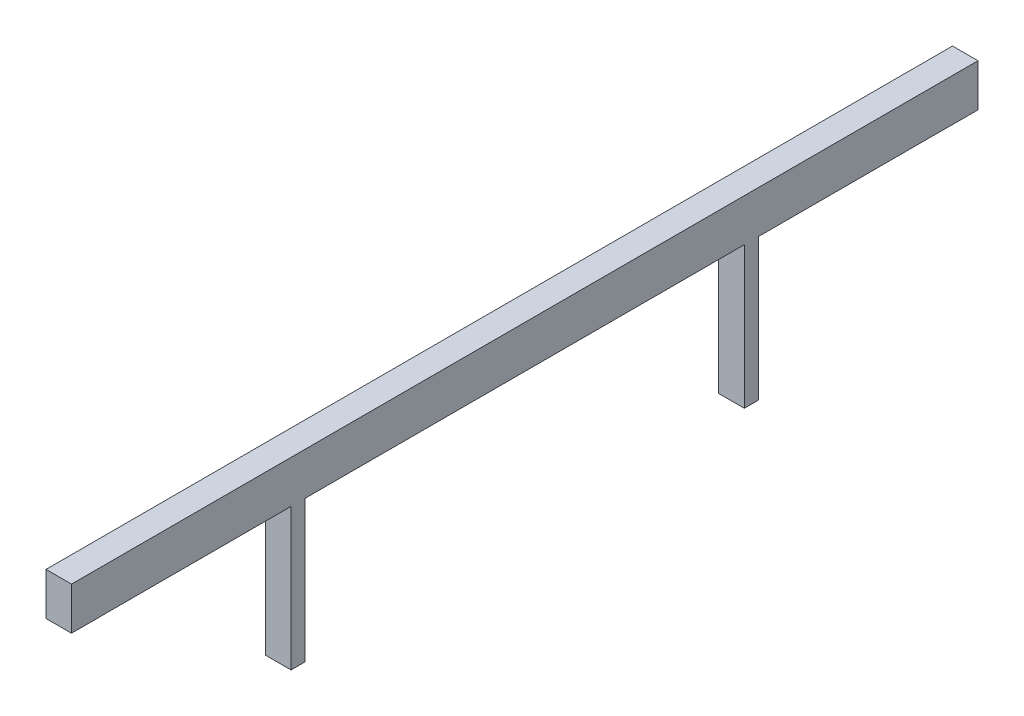
ISO-10303-21;
HEADER;
FILE_DESCRIPTION(('STEP AP214'),'2;1');
FILE_NAME('part.step','',(''),(''),'','','');
FILE_SCHEMA(('AUTOMOTIVE_DESIGN { 1 0 10303 214 1 1 1 1 }'));
ENDSEC;
DATA;
#1=APPLICATION_CONTEXT('core data for automotive mechanical design processes');
#2=APPLICATION_PROTOCOL_DEFINITION('international standard','automotive_design',2000,#1);
#3=PRODUCT_CONTEXT('',#1,'mechanical');
#4=PRODUCT('Part','Part','',(#3));
#5=PRODUCT_RELATED_PRODUCT_CATEGORY('part','',(#4));
#6=PRODUCT_DEFINITION_FORMATION('','',#4);
#7=PRODUCT_DEFINITION_CONTEXT('part definition',#1,'design');
#8=PRODUCT_DEFINITION('design','',#6,#7);
#9=PRODUCT_DEFINITION_SHAPE('','',#8);
#10=(LENGTH_UNIT() NAMED_UNIT(*) SI_UNIT(.MILLI.,.METRE.));
#11=(NAMED_UNIT(*) PLANE_ANGLE_UNIT() SI_UNIT($,.RADIAN.));
#12=(NAMED_UNIT(*) SI_UNIT($,.STERADIAN.) SOLID_ANGLE_UNIT());
#13=UNCERTAINTY_MEASURE_WITH_UNIT(LENGTH_MEASURE(1.E-05),#10,'distance_accuracy_value','');
#14=(GEOMETRIC_REPRESENTATION_CONTEXT(3) GLOBAL_UNCERTAINTY_ASSIGNED_CONTEXT((#13)) GLOBAL_UNIT_ASSIGNED_CONTEXT((#10,
#11,#12)) REPRESENTATION_CONTEXT('',''));
#15=CARTESIAN_POINT('',(0.,0.,0.));
#16=DIRECTION('',(0.,0.,1.));
#17=DIRECTION('',(1.,0.,0.));
#18=AXIS2_PLACEMENT_3D('',#15,#16,#17);
#19=CARTESIAN_POINT('',(-9.,-15.,300.));
#20=DIRECTION('',(0.,1.,0.));
#21=DIRECTION('',(0.,0.,1.));
#22=AXIS2_PLACEMENT_3D('',#19,#20,#21);
#23=PLANE('',#22);
#24=DIRECTION('',(0.,0.,-1.));
#25=VECTOR('',#24,1.);
#26=CARTESIAN_POINT('',(9.,-15.,300.));
#27=LINE('',#26,#25);
#28=CARTESIAN_POINT('',(9.,-15.,-165.));
#29=VERTEX_POINT('',#28);
#30=CARTESIAN_POINT('',(9.,-15.,-300.));
#31=VERTEX_POINT('',#30);
#32=EDGE_CURVE('E54',#29,#31,#27,.T.);
#33=ORIENTED_EDGE('',*,*,#32,.F.);
#34=DIRECTION('',(-1.,0.,0.));
#35=VECTOR('',#34,1.);
#36=CARTESIAN_POINT('',(-9.05537632584334,-15.,-165.));
#37=LINE('',#36,#35);
#38=CARTESIAN_POINT('',(-9.,-15.,-165.));
#39=VERTEX_POINT('',#38);
#40=EDGE_CURVE('E200',#29,#39,#37,.T.);
#41=ORIENTED_EDGE('',*,*,#40,.T.);
#42=DIRECTION('',(0.,0.,-1.));
#43=VECTOR('',#42,1.);
#44=CARTESIAN_POINT('',(-9.,-15.,300.));
#45=LINE('',#44,#43);
#46=CARTESIAN_POINT('',(-9.,-15.,-300.));
#47=VERTEX_POINT('',#46);
#48=EDGE_CURVE('E295',#39,#47,#45,.T.);
#49=ORIENTED_EDGE('',*,*,#48,.T.);
#50=DIRECTION('',(1.,0.,0.));
#51=VECTOR('',#50,1.);
#52=CARTESIAN_POINT('',(-9.,-15.,-300.));
#53=LINE('',#52,#51);
#54=EDGE_CURVE('E287',#47,#31,#53,.T.);
#55=ORIENTED_EDGE('',*,*,#54,.T.);
#56=EDGE_LOOP('',(#33,#41,#49,#55));
#57=FACE_BOUND('',#56,.T.);
#58=ADVANCED_FACE('F39',(#57),#23,.F.);
#59=CARTESIAN_POINT('',(-9.,-15.,155.));
#60=VERTEX_POINT('',#59);
#61=CARTESIAN_POINT('',(-9.,-15.,-155.));
#62=VERTEX_POINT('',#61);
#63=EDGE_CURVE('E351',#60,#62,#45,.T.);
#64=ORIENTED_EDGE('',*,*,#63,.T.);
#65=DIRECTION('',(1.,0.,0.));
#66=VECTOR('',#65,1.);
#67=CARTESIAN_POINT('',(-9.05537632584334,-15.,-155.));
#68=LINE('',#67,#66);
#69=CARTESIAN_POINT('',(9.,-15.,-155.));
#70=VERTEX_POINT('',#69);
#71=EDGE_CURVE('E62',#62,#70,#68,.T.);
#72=ORIENTED_EDGE('',*,*,#71,.T.);
#73=CARTESIAN_POINT('',(9.,-15.,155.));
#74=VERTEX_POINT('',#73);
#75=EDGE_CURVE('E296',#74,#70,#27,.T.);
#76=ORIENTED_EDGE('',*,*,#75,.F.);
#77=DIRECTION('',(1.,0.,0.));
#78=VECTOR('',#77,1.);
#79=CARTESIAN_POINT('',(-9.,-15.,155.));
#80=LINE('',#79,#78);
#81=EDGE_CURVE('E11',#60,#74,#80,.T.);
#82=ORIENTED_EDGE('',*,*,#81,.F.);
#83=EDGE_LOOP('',(#64,#72,#76,#82));
#84=FACE_BOUND('',#83,.T.);
#85=ADVANCED_FACE('F350',(#84),#23,.F.);
#86=DIRECTION('',(-1.,0.,0.));
#87=VECTOR('',#86,1.);
#88=CARTESIAN_POINT('',(-9.05537632584334,-15.,165.));
#89=LINE('',#88,#87);
#90=CARTESIAN_POINT('',(9.,-15.,165.));
#91=VERTEX_POINT('',#90);
#92=CARTESIAN_POINT('',(-9.,-15.,165.));
#93=VERTEX_POINT('',#92);
#94=EDGE_CURVE('E213',#91,#93,#89,.T.);
#95=ORIENTED_EDGE('',*,*,#94,.F.);
#96=CARTESIAN_POINT('',(9.,-15.,300.));
#97=VERTEX_POINT('',#96);
#98=EDGE_CURVE('E292',#97,#91,#27,.T.);
#99=ORIENTED_EDGE('',*,*,#98,.F.);
#100=DIRECTION('',(1.,0.,0.));
#101=VECTOR('',#100,1.);
#102=CARTESIAN_POINT('',(-9.,-15.,300.));
#103=LINE('',#102,#101);
#104=CARTESIAN_POINT('',(-9.,-15.,300.));
#105=VERTEX_POINT('',#104);
#106=EDGE_CURVE('E288',#105,#97,#103,.T.);
#107=ORIENTED_EDGE('',*,*,#106,.F.);
#108=EDGE_CURVE('E297',#105,#93,#45,.T.);
#109=ORIENTED_EDGE('',*,*,#108,.T.);
#110=EDGE_LOOP('',(#95,#99,#107,#109));
#111=FACE_BOUND('',#110,.T.);
#112=ADVANCED_FACE('F334',(#111),#23,.F.);
#113=CARTESIAN_POINT('',(9.,-15.,300.));
#114=DIRECTION('',(-1.,0.,0.));
#115=DIRECTION('',(0.,0.,1.));
#116=AXIS2_PLACEMENT_3D('',#113,#114,#115);
#117=PLANE('',#116);
#118=ORIENTED_EDGE('',*,*,#98,.T.);
#119=DIRECTION('',(0.,1.,0.));
#120=VECTOR('',#119,1.);
#121=CARTESIAN_POINT('',(9.,-115.,165.));
#122=LINE('',#121,#120);
#123=CARTESIAN_POINT('',(9.,-115.,165.));
#124=VERTEX_POINT('',#123);
#125=EDGE_CURVE('E230',#124,#91,#122,.T.);
#126=ORIENTED_EDGE('',*,*,#125,.F.);
#127=DIRECTION('',(0.,0.,1.));
#128=VECTOR('',#127,1.);
#129=CARTESIAN_POINT('',(9.,-115.,165.));
#130=LINE('',#129,#128);
#131=CARTESIAN_POINT('',(9.,-115.,155.));
#132=VERTEX_POINT('',#131);
#133=EDGE_CURVE('E215',#132,#124,#130,.T.);
#134=ORIENTED_EDGE('',*,*,#133,.F.);
#135=DIRECTION('',(0.,1.,0.));
#136=VECTOR('',#135,1.);
#137=CARTESIAN_POINT('',(9.,-115.,155.));
#138=LINE('',#137,#136);
#139=EDGE_CURVE('E233',#132,#74,#138,.T.);
#140=ORIENTED_EDGE('',*,*,#139,.T.);
#141=ORIENTED_EDGE('',*,*,#75,.T.);
#142=DIRECTION('',(0.,1.,0.));
#143=VECTOR('',#142,1.);
#144=CARTESIAN_POINT('',(9.,-115.,-155.));
#145=LINE('',#144,#143);
#146=CARTESIAN_POINT('',(9.,-115.,-155.));
#147=VERTEX_POINT('',#146);
#148=EDGE_CURVE('E205',#147,#70,#145,.T.);
#149=ORIENTED_EDGE('',*,*,#148,.F.);
#150=DIRECTION('',(0.,0.,-1.));
#151=VECTOR('',#150,1.);
#152=CARTESIAN_POINT('',(9.,-115.,-165.));
#153=LINE('',#152,#151);
#154=CARTESIAN_POINT('',(9.,-115.,-165.));
#155=VERTEX_POINT('',#154);
#156=EDGE_CURVE('E192',#147,#155,#153,.T.);
#157=ORIENTED_EDGE('',*,*,#156,.T.);
#158=DIRECTION('',(0.,1.,0.));
#159=VECTOR('',#158,1.);
#160=CARTESIAN_POINT('',(9.,-115.,-165.));
#161=LINE('',#160,#159);
#162=EDGE_CURVE('E178',#155,#29,#161,.T.);
#163=ORIENTED_EDGE('',*,*,#162,.T.);
#164=ORIENTED_EDGE('',*,*,#32,.T.);
#165=DIRECTION('',(0.,1.,0.));
#166=VECTOR('',#165,1.);
#167=CARTESIAN_POINT('',(9.,-15.05,-300.));
#168=LINE('',#167,#166);
#169=CARTESIAN_POINT('',(9.,-15.05,-300.));
#170=VERTEX_POINT('',#169);
#171=EDGE_CURVE('E239',#170,#31,#168,.T.);
#172=ORIENTED_EDGE('',*,*,#171,.F.);
#173=DIRECTION('',(0.,0.,1.));
#174=VECTOR('',#173,1.);
#175=CARTESIAN_POINT('',(9.,-15.05,-320.));
#176=LINE('',#175,#174);
#177=CARTESIAN_POINT('',(9.,-15.05,-320.));
#178=VERTEX_POINT('',#177);
#179=EDGE_CURVE('E261',#178,#170,#176,.T.);
#180=ORIENTED_EDGE('',*,*,#179,.F.);
#181=DIRECTION('',(0.,1.,0.));
#182=VECTOR('',#181,1.);
#183=CARTESIAN_POINT('',(9.,15.,-320.));
#184=LINE('',#183,#182);
#185=CARTESIAN_POINT('',(9.,15.,-320.));
#186=VERTEX_POINT('',#185);
#187=EDGE_CURVE('E246',#178,#186,#184,.T.);
#188=ORIENTED_EDGE('',*,*,#187,.T.);
#189=DIRECTION('',(0.,0.,-1.));
#190=VECTOR('',#189,1.);
#191=CARTESIAN_POINT('',(9.,15.,300.));
#192=LINE('',#191,#190);
#193=CARTESIAN_POINT('',(9.,15.,320.));
#194=VERTEX_POINT('',#193);
#195=EDGE_CURVE('E47',#194,#186,#192,.T.);
#196=ORIENTED_EDGE('',*,*,#195,.F.);
#197=DIRECTION('',(0.,1.,0.));
#198=VECTOR('',#197,1.);
#199=CARTESIAN_POINT('',(9.,-15.05,320.));
#200=LINE('',#199,#198);
#201=CARTESIAN_POINT('',(9.,-15.05,320.));
#202=VERTEX_POINT('',#201);
#203=EDGE_CURVE('E269',#202,#194,#200,.T.);
#204=ORIENTED_EDGE('',*,*,#203,.F.);
#205=DIRECTION('',(0.,0.,-1.));
#206=VECTOR('',#205,1.);
#207=CARTESIAN_POINT('',(9.,-15.05,320.));
#208=LINE('',#207,#206);
#209=CARTESIAN_POINT('',(9.,-15.05,300.));
#210=VERTEX_POINT('',#209);
#211=EDGE_CURVE('E275',#202,#210,#208,.T.);
#212=ORIENTED_EDGE('',*,*,#211,.T.);
#213=DIRECTION('',(0.,1.,0.));
#214=VECTOR('',#213,1.);
#215=CARTESIAN_POINT('',(9.,15.,300.));
#216=LINE('',#215,#214);
#217=EDGE_CURVE('E267',#210,#97,#216,.T.);
#218=ORIENTED_EDGE('',*,*,#217,.T.);
#219=EDGE_LOOP('',(#118,#126,#134,#140,#141,#149,#157,#163,#164,#172,#180,#188,#196,#204,#212,#218));
#220=FACE_BOUND('',#219,.T.);
#221=ADVANCED_FACE('F41',(#220),#117,.F.);
#222=CARTESIAN_POINT('',(-9.,15.,300.));
#223=DIRECTION('',(0.,-1.,0.));
#224=DIRECTION('',(0.,0.,-1.));
#225=AXIS2_PLACEMENT_3D('',#222,#223,#224);
#226=PLANE('',#225);
#227=ORIENTED_EDGE('',*,*,#195,.T.);
#228=DIRECTION('',(-1.,0.,0.));
#229=VECTOR('',#228,1.);
#230=CARTESIAN_POINT('',(-9.,15.,-320.));
#231=LINE('',#230,#229);
#232=CARTESIAN_POINT('',(-9.,15.,-320.));
#233=VERTEX_POINT('',#232);
#234=EDGE_CURVE('E242',#186,#233,#231,.T.);
#235=ORIENTED_EDGE('',*,*,#234,.T.);
#236=DIRECTION('',(0.,0.,-1.));
#237=VECTOR('',#236,1.);
#238=CARTESIAN_POINT('',(-9.,15.,300.));
#239=LINE('',#238,#237);
#240=CARTESIAN_POINT('',(-9.,15.,320.));
#241=VERTEX_POINT('',#240);
#242=EDGE_CURVE('E299',#241,#233,#239,.T.);
#243=ORIENTED_EDGE('',*,*,#242,.F.);
#244=DIRECTION('',(-1.,0.,0.));
#245=VECTOR('',#244,1.);
#246=CARTESIAN_POINT('',(-9.,15.,320.));
#247=LINE('',#246,#245);
#248=EDGE_CURVE('E272',#194,#241,#247,.T.);
#249=ORIENTED_EDGE('',*,*,#248,.F.);
#250=EDGE_LOOP('',(#227,#235,#243,#249));
#251=FACE_BOUND('',#250,.T.);
#252=ADVANCED_FACE('F304',(#251),#226,.F.);
#253=CARTESIAN_POINT('',(-9.,-15.,300.));
#254=DIRECTION('',(1.,0.,0.));
#255=DIRECTION('',(0.,0.,-1.));
#256=AXIS2_PLACEMENT_3D('',#253,#254,#255);
#257=PLANE('',#256);
#258=ORIENTED_EDGE('',*,*,#242,.T.);
#259=DIRECTION('',(0.,-1.,0.));
#260=VECTOR('',#259,1.);
#261=CARTESIAN_POINT('',(-9.,-15.,-320.));
#262=LINE('',#261,#260);
#263=CARTESIAN_POINT('',(-9.,-15.05,-320.));
#264=VERTEX_POINT('',#263);
#265=EDGE_CURVE('E240',#233,#264,#262,.T.);
#266=ORIENTED_EDGE('',*,*,#265,.T.);
#267=DIRECTION('',(0.,0.,1.));
#268=VECTOR('',#267,1.);
#269=CARTESIAN_POINT('',(-9.,-15.05,-320.));
#270=LINE('',#269,#268);
#271=CARTESIAN_POINT('',(-9.,-15.05,-300.));
#272=VERTEX_POINT('',#271);
#273=EDGE_CURVE('E252',#264,#272,#270,.T.);
#274=ORIENTED_EDGE('',*,*,#273,.T.);
#275=DIRECTION('',(0.,-1.,0.));
#276=VECTOR('',#275,1.);
#277=CARTESIAN_POINT('',(-9.,-15.,-300.));
#278=LINE('',#277,#276);
#279=EDGE_CURVE('E243',#47,#272,#278,.T.);
#280=ORIENTED_EDGE('',*,*,#279,.F.);
#281=ORIENTED_EDGE('',*,*,#48,.F.);
#282=EDGE_CURVE('E355',#62,#39,#45,.T.);
#283=ORIENTED_EDGE('',*,*,#282,.F.);
#284=ORIENTED_EDGE('',*,*,#63,.F.);
#285=EDGE_CURVE('E300',#93,#60,#45,.T.);
#286=ORIENTED_EDGE('',*,*,#285,.F.);
#287=ORIENTED_EDGE('',*,*,#108,.F.);
#288=DIRECTION('',(0.,-1.,0.));
#289=VECTOR('',#288,1.);
#290=CARTESIAN_POINT('',(-9.,-15.,300.));
#291=LINE('',#290,#289);
#292=CARTESIAN_POINT('',(-9.,-15.05,300.));
#293=VERTEX_POINT('',#292);
#294=EDGE_CURVE('E263',#105,#293,#291,.T.);
#295=ORIENTED_EDGE('',*,*,#294,.T.);
#296=DIRECTION('',(0.,0.,-1.));
#297=VECTOR('',#296,1.);
#298=CARTESIAN_POINT('',(-9.,-15.05,320.));
#299=LINE('',#298,#297);
#300=CARTESIAN_POINT('',(-9.,-15.05,320.));
#301=VERTEX_POINT('',#300);
#302=EDGE_CURVE('E284',#301,#293,#299,.T.);
#303=ORIENTED_EDGE('',*,*,#302,.F.);
#304=DIRECTION('',(0.,-1.,0.));
#305=VECTOR('',#304,1.);
#306=CARTESIAN_POINT('',(-9.,-15.,320.));
#307=LINE('',#306,#305);
#308=EDGE_CURVE('E264',#241,#301,#307,.T.);
#309=ORIENTED_EDGE('',*,*,#308,.F.);
#310=EDGE_LOOP('',(#258,#266,#274,#280,#281,#283,#284,#286,#287,#295,#303,#309));
#311=FACE_BOUND('',#310,.T.);
#312=ADVANCED_FACE('F319',(#311),#257,.F.);
#313=CARTESIAN_POINT('',(-9.,-15.05,320.));
#314=DIRECTION('',(0.,1.,0.));
#315=DIRECTION('',(0.,0.,1.));
#316=AXIS2_PLACEMENT_3D('',#313,#314,#315);
#317=PLANE('',#316);
#318=DIRECTION('',(1.,0.,0.));
#319=VECTOR('',#318,1.);
#320=CARTESIAN_POINT('',(-9.,-15.05,300.));
#321=LINE('',#320,#319);
#322=EDGE_CURVE('E277',#293,#210,#321,.T.);
#323=ORIENTED_EDGE('',*,*,#322,.T.);
#324=ORIENTED_EDGE('',*,*,#211,.F.);
#325=DIRECTION('',(1.,0.,0.));
#326=VECTOR('',#325,1.);
#327=CARTESIAN_POINT('',(-9.,-15.05,320.));
#328=LINE('',#327,#326);
#329=EDGE_CURVE('E266',#301,#202,#328,.T.);
#330=ORIENTED_EDGE('',*,*,#329,.F.);
#331=ORIENTED_EDGE('',*,*,#302,.T.);
#332=EDGE_LOOP('',(#323,#324,#330,#331));
#333=FACE_BOUND('',#332,.T.);
#334=ADVANCED_FACE('F327',(#333),#317,.F.);
#335=CARTESIAN_POINT('',(0.,0.,320.));
#336=DIRECTION('',(0.,0.,-1.));
#337=DIRECTION('',(-1.,0.,0.));
#338=AXIS2_PLACEMENT_3D('',#335,#336,#337);
#339=PLANE('',#338);
#340=ORIENTED_EDGE('',*,*,#308,.T.);
#341=ORIENTED_EDGE('',*,*,#329,.T.);
#342=ORIENTED_EDGE('',*,*,#203,.T.);
#343=ORIENTED_EDGE('',*,*,#248,.T.);
#344=EDGE_LOOP('',(#340,#341,#342,#343));
#345=FACE_BOUND('',#344,.T.);
#346=ADVANCED_FACE('F323',(#345),#339,.F.);
#347=CARTESIAN_POINT('',(0.,0.,300.));
#348=DIRECTION('',(0.,0.,-1.));
#349=DIRECTION('',(-1.,0.,0.));
#350=AXIS2_PLACEMENT_3D('',#347,#348,#349);
#351=PLANE('',#350);
#352=ORIENTED_EDGE('',*,*,#294,.F.);
#353=ORIENTED_EDGE('',*,*,#106,.T.);
#354=ORIENTED_EDGE('',*,*,#217,.F.);
#355=ORIENTED_EDGE('',*,*,#322,.F.);
#356=EDGE_LOOP('',(#352,#353,#354,#355));
#357=FACE_BOUND('',#356,.T.);
#358=ADVANCED_FACE('F331',(#357),#351,.T.);
#359=CARTESIAN_POINT('',(0.,0.,-300.));
#360=DIRECTION('',(0.,0.,1.));
#361=DIRECTION('',(-1.,0.,0.));
#362=AXIS2_PLACEMENT_3D('',#359,#360,#361);
#363=PLANE('',#362);
#364=ORIENTED_EDGE('',*,*,#54,.F.);
#365=ORIENTED_EDGE('',*,*,#279,.T.);
#366=DIRECTION('',(1.,0.,0.));
#367=VECTOR('',#366,1.);
#368=CARTESIAN_POINT('',(-9.,-15.05,-300.));
#369=LINE('',#368,#367);
#370=EDGE_CURVE('E255',#272,#170,#369,.T.);
#371=ORIENTED_EDGE('',*,*,#370,.T.);
#372=ORIENTED_EDGE('',*,*,#171,.T.);
#373=EDGE_LOOP('',(#364,#365,#371,#372));
#374=FACE_BOUND('',#373,.T.);
#375=ADVANCED_FACE('F396',(#374),#363,.T.);
#376=CARTESIAN_POINT('',(-9.,-15.05,-320.));
#377=DIRECTION('',(0.,-1.,0.));
#378=DIRECTION('',(0.,0.,-1.));
#379=AXIS2_PLACEMENT_3D('',#376,#377,#378);
#380=PLANE('',#379);
#381=ORIENTED_EDGE('',*,*,#370,.F.);
#382=ORIENTED_EDGE('',*,*,#273,.F.);
#383=DIRECTION('',(1.,0.,0.));
#384=VECTOR('',#383,1.);
#385=CARTESIAN_POINT('',(-9.,-15.05,-320.));
#386=LINE('',#385,#384);
#387=EDGE_CURVE('E249',#264,#178,#386,.T.);
#388=ORIENTED_EDGE('',*,*,#387,.T.);
#389=ORIENTED_EDGE('',*,*,#179,.T.);
#390=EDGE_LOOP('',(#381,#382,#388,#389));
#391=FACE_BOUND('',#390,.T.);
#392=ADVANCED_FACE('F316',(#391),#380,.T.);
#393=CARTESIAN_POINT('',(0.,0.,-320.));
#394=DIRECTION('',(0.,0.,1.));
#395=DIRECTION('',(-1.,0.,0.));
#396=AXIS2_PLACEMENT_3D('',#393,#394,#395);
#397=PLANE('',#396);
#398=ORIENTED_EDGE('',*,*,#265,.F.);
#399=ORIENTED_EDGE('',*,*,#234,.F.);
#400=ORIENTED_EDGE('',*,*,#187,.F.);
#401=ORIENTED_EDGE('',*,*,#387,.F.);
#402=EDGE_LOOP('',(#398,#399,#400,#401));
#403=FACE_BOUND('',#402,.T.);
#404=ADVANCED_FACE('F309',(#403),#397,.F.);
#405=CARTESIAN_POINT('',(0.,-15.,0.));
#406=DIRECTION('',(0.,-1.,0.));
#407=DIRECTION('',(0.,0.,-1.));
#408=AXIS2_PLACEMENT_3D('',#405,#406,#407);
#409=PLANE('',#408);
#410=CARTESIAN_POINT('',(-9.05537632584334,-15.,165.));
#411=VERTEX_POINT('',#410);
#412=EDGE_CURVE('E225',#93,#411,#89,.T.);
#413=ORIENTED_EDGE('',*,*,#412,.F.);
#414=ORIENTED_EDGE('',*,*,#285,.T.);
#415=DIRECTION('',(1.,0.,0.));
#416=VECTOR('',#415,1.);
#417=CARTESIAN_POINT('',(-9.05537632584334,-15.,155.));
#418=LINE('',#417,#416);
#419=CARTESIAN_POINT('',(-9.05537632584334,-15.,155.));
#420=VERTEX_POINT('',#419);
#421=EDGE_CURVE('E222',#420,#60,#418,.T.);
#422=ORIENTED_EDGE('',*,*,#421,.F.);
#423=DIRECTION('',(0.,0.,-1.));
#424=VECTOR('',#423,1.);
#425=CARTESIAN_POINT('',(-9.05537632584334,-15.,165.));
#426=LINE('',#425,#424);
#427=EDGE_CURVE('E177',#411,#420,#426,.T.);
#428=ORIENTED_EDGE('',*,*,#427,.F.);
#429=EDGE_LOOP('',(#413,#414,#422,#428));
#430=FACE_BOUND('',#429,.T.);
#431=ADVANCED_FACE('F357',(#430),#409,.F.);
#432=CARTESIAN_POINT('',(-9.05537632584334,-115.,165.));
#433=DIRECTION('',(1.,0.,0.));
#434=DIRECTION('',(0.,0.,-1.));
#435=AXIS2_PLACEMENT_3D('',#432,#433,#434);
#436=PLANE('',#435);
#437=ORIENTED_EDGE('',*,*,#427,.T.);
#438=DIRECTION('',(0.,1.,0.));
#439=VECTOR('',#438,1.);
#440=CARTESIAN_POINT('',(-9.05537632584334,-115.,155.));
#441=LINE('',#440,#439);
#442=CARTESIAN_POINT('',(-9.05537632584334,-115.,155.));
#443=VERTEX_POINT('',#442);
#444=EDGE_CURVE('E236',#443,#420,#441,.T.);
#445=ORIENTED_EDGE('',*,*,#444,.F.);
#446=DIRECTION('',(0.,0.,-1.));
#447=VECTOR('',#446,1.);
#448=CARTESIAN_POINT('',(-9.05537632584334,-115.,165.));
#449=LINE('',#448,#447);
#450=CARTESIAN_POINT('',(-9.05537632584334,-115.,165.));
#451=VERTEX_POINT('',#450);
#452=EDGE_CURVE('E209',#451,#443,#449,.T.);
#453=ORIENTED_EDGE('',*,*,#452,.F.);
#454=DIRECTION('',(0.,1.,0.));
#455=VECTOR('',#454,1.);
#456=CARTESIAN_POINT('',(-9.05537632584334,-115.,165.));
#457=LINE('',#456,#455);
#458=EDGE_CURVE('E219',#451,#411,#457,.T.);
#459=ORIENTED_EDGE('',*,*,#458,.T.);
#460=EDGE_LOOP('',(#437,#445,#453,#459));
#461=FACE_BOUND('',#460,.T.);
#462=ADVANCED_FACE('F360',(#461),#436,.F.);
#463=CARTESIAN_POINT('',(-9.05537632584334,-115.,155.));
#464=DIRECTION('',(0.,0.,1.));
#465=DIRECTION('',(1.,0.,0.));
#466=AXIS2_PLACEMENT_3D('',#463,#464,#465);
#467=PLANE('',#466);
#468=ORIENTED_EDGE('',*,*,#421,.T.);
#469=ORIENTED_EDGE('',*,*,#81,.T.);
#470=ORIENTED_EDGE('',*,*,#139,.F.);
#471=DIRECTION('',(1.,0.,0.));
#472=VECTOR('',#471,1.);
#473=CARTESIAN_POINT('',(-9.05537632584334,-115.,155.));
#474=LINE('',#473,#472);
#475=EDGE_CURVE('E212',#443,#132,#474,.T.);
#476=ORIENTED_EDGE('',*,*,#475,.F.);
#477=ORIENTED_EDGE('',*,*,#444,.T.);
#478=EDGE_LOOP('',(#468,#469,#470,#476,#477));
#479=FACE_BOUND('',#478,.T.);
#480=ADVANCED_FACE('F348',(#479),#467,.F.);
#481=CARTESIAN_POINT('',(-9.05537632584334,-115.,165.));
#482=DIRECTION('',(0.,0.,-1.));
#483=DIRECTION('',(-1.,0.,0.));
#484=AXIS2_PLACEMENT_3D('',#481,#482,#483);
#485=PLANE('',#484);
#486=ORIENTED_EDGE('',*,*,#94,.T.);
#487=ORIENTED_EDGE('',*,*,#412,.T.);
#488=ORIENTED_EDGE('',*,*,#458,.F.);
#489=DIRECTION('',(-1.,0.,0.));
#490=VECTOR('',#489,1.);
#491=CARTESIAN_POINT('',(-9.05537632584334,-115.,165.));
#492=LINE('',#491,#490);
#493=EDGE_CURVE('E217',#124,#451,#492,.T.);
#494=ORIENTED_EDGE('',*,*,#493,.F.);
#495=ORIENTED_EDGE('',*,*,#125,.T.);
#496=EDGE_LOOP('',(#486,#487,#488,#494,#495));
#497=FACE_BOUND('',#496,.T.);
#498=ADVANCED_FACE('F340',(#497),#485,.F.);
#499=CARTESIAN_POINT('',(0.,-115.,0.));
#500=DIRECTION('',(0.,-1.,0.));
#501=DIRECTION('',(0.,0.,-1.));
#502=AXIS2_PLACEMENT_3D('',#499,#500,#501);
#503=PLANE('',#502);
#504=ORIENTED_EDGE('',*,*,#452,.T.);
#505=ORIENTED_EDGE('',*,*,#475,.T.);
#506=ORIENTED_EDGE('',*,*,#133,.T.);
#507=ORIENTED_EDGE('',*,*,#493,.T.);
#508=EDGE_LOOP('',(#504,#505,#506,#507));
#509=FACE_BOUND('',#508,.T.);
#510=ADVANCED_FACE('F344',(#509),#503,.T.);
#511=CARTESIAN_POINT('',(0.,-15.,0.));
#512=DIRECTION('',(0.,-1.,0.));
#513=DIRECTION('',(0.,0.,1.));
#514=AXIS2_PLACEMENT_3D('',#511,#512,#513);
#515=PLANE('',#514);
#516=CARTESIAN_POINT('',(-9.05537632584334,-15.,-155.));
#517=VERTEX_POINT('',#516);
#518=EDGE_CURVE('E188',#517,#62,#68,.T.);
#519=ORIENTED_EDGE('',*,*,#518,.T.);
#520=ORIENTED_EDGE('',*,*,#282,.T.);
#521=CARTESIAN_POINT('',(-9.05537632584334,-15.,-165.));
#522=VERTEX_POINT('',#521);
#523=EDGE_CURVE('E199',#39,#522,#37,.T.);
#524=ORIENTED_EDGE('',*,*,#523,.T.);
#525=DIRECTION('',(0.,0.,1.));
#526=VECTOR('',#525,1.);
#527=CARTESIAN_POINT('',(-9.05537632584334,-15.,-165.));
#528=LINE('',#527,#526);
#529=EDGE_CURVE('E173',#522,#517,#528,.T.);
#530=ORIENTED_EDGE('',*,*,#529,.T.);
#531=EDGE_LOOP('',(#519,#520,#524,#530));
#532=FACE_BOUND('',#531,.T.);
#533=ADVANCED_FACE('F440',(#532),#515,.F.);
#534=CARTESIAN_POINT('',(-9.05537632584334,-115.,-165.));
#535=DIRECTION('',(-1.,0.,0.));
#536=DIRECTION('',(0.,0.,1.));
#537=AXIS2_PLACEMENT_3D('',#534,#535,#536);
#538=PLANE('',#537);
#539=ORIENTED_EDGE('',*,*,#529,.F.);
#540=DIRECTION('',(0.,1.,0.));
#541=VECTOR('',#540,1.);
#542=CARTESIAN_POINT('',(-9.05537632584334,-115.,-165.));
#543=LINE('',#542,#541);
#544=CARTESIAN_POINT('',(-9.05537632584334,-115.,-165.));
#545=VERTEX_POINT('',#544);
#546=EDGE_CURVE('E167',#545,#522,#543,.T.);
#547=ORIENTED_EDGE('',*,*,#546,.F.);
#548=DIRECTION('',(0.,0.,1.));
#549=VECTOR('',#548,1.);
#550=CARTESIAN_POINT('',(-9.05537632584334,-115.,-165.));
#551=LINE('',#550,#549);
#552=CARTESIAN_POINT('',(-9.05537632584334,-115.,-155.));
#553=VERTEX_POINT('',#552);
#554=EDGE_CURVE('E170',#545,#553,#551,.T.);
#555=ORIENTED_EDGE('',*,*,#554,.T.);
#556=DIRECTION('',(0.,1.,0.));
#557=VECTOR('',#556,1.);
#558=CARTESIAN_POINT('',(-9.05537632584334,-115.,-155.));
#559=LINE('',#558,#557);
#560=EDGE_CURVE('E197',#553,#517,#559,.T.);
#561=ORIENTED_EDGE('',*,*,#560,.T.);
#562=EDGE_LOOP('',(#539,#547,#555,#561));
#563=FACE_BOUND('',#562,.T.);
#564=ADVANCED_FACE('F169',(#563),#538,.T.);
#565=CARTESIAN_POINT('',(-9.05537632584334,-115.,-165.));
#566=DIRECTION('',(0.,0.,-1.));
#567=DIRECTION('',(-1.,0.,0.));
#568=AXIS2_PLACEMENT_3D('',#565,#566,#567);
#569=PLANE('',#568);
#570=ORIENTED_EDGE('',*,*,#40,.F.);
#571=ORIENTED_EDGE('',*,*,#162,.F.);
#572=DIRECTION('',(-1.,0.,0.));
#573=VECTOR('',#572,1.);
#574=CARTESIAN_POINT('',(-9.05537632584334,-115.,-165.));
#575=LINE('',#574,#573);
#576=EDGE_CURVE('E184',#155,#545,#575,.T.);
#577=ORIENTED_EDGE('',*,*,#576,.T.);
#578=ORIENTED_EDGE('',*,*,#546,.T.);
#579=ORIENTED_EDGE('',*,*,#523,.F.);
#580=EDGE_LOOP('',(#570,#571,#577,#578,#579));
#581=FACE_BOUND('',#580,.T.);
#582=ADVANCED_FACE('F191',(#581),#569,.T.);
#583=CARTESIAN_POINT('',(-9.05537632584334,-115.,-155.));
#584=DIRECTION('',(0.,0.,1.));
#585=DIRECTION('',(1.,0.,0.));
#586=AXIS2_PLACEMENT_3D('',#583,#584,#585);
#587=PLANE('',#586);
#588=ORIENTED_EDGE('',*,*,#518,.F.);
#589=ORIENTED_EDGE('',*,*,#560,.F.);
#590=DIRECTION('',(1.,0.,0.));
#591=VECTOR('',#590,1.);
#592=CARTESIAN_POINT('',(-9.05537632584334,-115.,-155.));
#593=LINE('',#592,#591);
#594=EDGE_CURVE('E187',#553,#147,#593,.T.);
#595=ORIENTED_EDGE('',*,*,#594,.T.);
#596=ORIENTED_EDGE('',*,*,#148,.T.);
#597=ORIENTED_EDGE('',*,*,#71,.F.);
#598=EDGE_LOOP('',(#588,#589,#595,#596,#597));
#599=FACE_BOUND('',#598,.T.);
#600=ADVANCED_FACE('F487',(#599),#587,.T.);
#601=CARTESIAN_POINT('',(0.,-115.,0.));
#602=DIRECTION('',(0.,-1.,0.));
#603=DIRECTION('',(0.,0.,1.));
#604=AXIS2_PLACEMENT_3D('',#601,#602,#603);
#605=PLANE('',#604);
#606=ORIENTED_EDGE('',*,*,#554,.F.);
#607=ORIENTED_EDGE('',*,*,#576,.F.);
#608=ORIENTED_EDGE('',*,*,#156,.F.);
#609=ORIENTED_EDGE('',*,*,#594,.F.);
#610=EDGE_LOOP('',(#606,#607,#608,#609));
#611=FACE_BOUND('',#610,.T.);
#612=ADVANCED_FACE('F182',(#611),#605,.T.);
#613=CLOSED_SHELL('',(#58,#85,#112,#221,#252,#312,#334,#346,#358,#375,#392,#404,#431,#462,#480,
#498,#510,#533,#564,#582,#600,#612));
#614=MANIFOLD_SOLID_BREP('B2',#613);
#615=ADVANCED_BREP_SHAPE_REPRESENTATION('',(#18,#614),#14);
#616=SHAPE_DEFINITION_REPRESENTATION(#9,#615);
ENDSEC;
END-ISO-10303-21;
